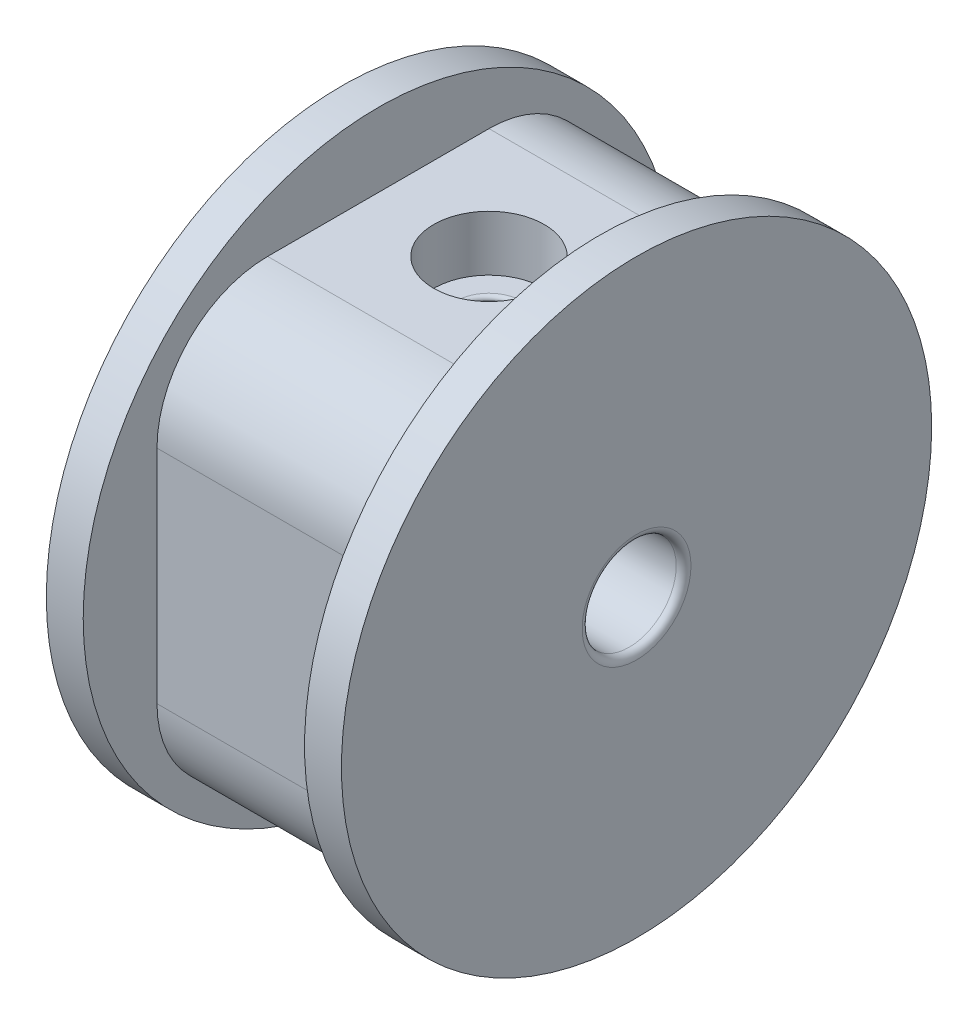
ISO-10303-21;
HEADER;
FILE_DESCRIPTION(('STEP AP214'),'2;1');
FILE_NAME('part.step','',(''),(''),'','','');
FILE_SCHEMA(('AUTOMOTIVE_DESIGN { 1 0 10303 214 1 1 1 1 }'));
ENDSEC;
DATA;
#1=APPLICATION_CONTEXT('core data for automotive mechanical design processes');
#2=APPLICATION_PROTOCOL_DEFINITION('international standard','automotive_design',2000,#1);
#3=PRODUCT_CONTEXT('',#1,'mechanical');
#4=PRODUCT('Part','Part','',(#3));
#5=PRODUCT_RELATED_PRODUCT_CATEGORY('part','',(#4));
#6=PRODUCT_DEFINITION_FORMATION('','',#4);
#7=PRODUCT_DEFINITION_CONTEXT('part definition',#1,'design');
#8=PRODUCT_DEFINITION('design','',#6,#7);
#9=PRODUCT_DEFINITION_SHAPE('','',#8);
#10=(LENGTH_UNIT() NAMED_UNIT(*) SI_UNIT(.MILLI.,.METRE.));
#11=(NAMED_UNIT(*) PLANE_ANGLE_UNIT() SI_UNIT($,.RADIAN.));
#12=(NAMED_UNIT(*) SI_UNIT($,.STERADIAN.) SOLID_ANGLE_UNIT());
#13=UNCERTAINTY_MEASURE_WITH_UNIT(LENGTH_MEASURE(1.E-05),#10,'distance_accuracy_value','');
#14=(GEOMETRIC_REPRESENTATION_CONTEXT(3) GLOBAL_UNCERTAINTY_ASSIGNED_CONTEXT((#13)) GLOBAL_UNIT_ASSIGNED_CONTEXT((#10,
#11,#12)) REPRESENTATION_CONTEXT('',''));
#15=CARTESIAN_POINT('',(0.,0.,0.));
#16=DIRECTION('',(0.,0.,1.));
#17=DIRECTION('',(1.,0.,0.));
#18=AXIS2_PLACEMENT_3D('',#15,#16,#17);
#19=CARTESIAN_POINT('',(12.,0.,0.));
#20=DIRECTION('',(0.,0.,1.));
#21=DIRECTION('',(1.,0.,0.));
#22=AXIS2_PLACEMENT_3D('',#19,#20,#21);
#23=PLANE('',#22);
#24=DIRECTION('',(0.,1.,0.));
#25=VECTOR('',#24,1.);
#26=CARTESIAN_POINT('',(12.,0.,0.));
#27=LINE('',#26,#25);
#28=CARTESIAN_POINT('',(12.,6.,0.));
#29=VERTEX_POINT('',#28);
#30=CARTESIAN_POINT('',(12.,18.,0.));
#31=VERTEX_POINT('',#30);
#32=EDGE_CURVE('E244',#29,#31,#27,.T.);
#33=ORIENTED_EDGE('',*,*,#32,.F.);
#34=DIRECTION('',(-1.,0.,0.));
#35=VECTOR('',#34,1.);
#36=CARTESIAN_POINT('',(12.,6.,0.));
#37=LINE('',#36,#35);
#38=CARTESIAN_POINT('',(0.,6.,0.));
#39=VERTEX_POINT('',#38);
#40=EDGE_CURVE('E109',#29,#39,#37,.T.);
#41=ORIENTED_EDGE('',*,*,#40,.T.);
#42=DIRECTION('',(0.,1.,0.));
#43=VECTOR('',#42,1.);
#44=CARTESIAN_POINT('',(0.,0.,0.));
#45=LINE('',#44,#43);
#46=CARTESIAN_POINT('',(0.,18.,0.));
#47=VERTEX_POINT('',#46);
#48=EDGE_CURVE('E114',#39,#47,#45,.T.);
#49=ORIENTED_EDGE('',*,*,#48,.T.);
#50=DIRECTION('',(-1.,0.,0.));
#51=VECTOR('',#50,1.);
#52=CARTESIAN_POINT('',(12.,18.,0.));
#53=LINE('',#52,#51);
#54=EDGE_CURVE('E98',#47,#31,#53,.F.);
#55=ORIENTED_EDGE('',*,*,#54,.T.);
#56=EDGE_LOOP('',(#33,#41,#49,#55));
#57=FACE_BOUND('',#56,.T.);
#58=ADVANCED_FACE('F34',(#57),#23,.F.);
#59=CARTESIAN_POINT('',(12.,24.,0.));
#60=DIRECTION('',(0.,-1.,0.));
#61=DIRECTION('',(0.,0.,-1.));
#62=AXIS2_PLACEMENT_3D('',#59,#60,#61);
#63=PLANE('',#62);
#64=CARTESIAN_POINT('',(6.,24.,12.));
#65=DIRECTION('',(0.,1.,0.));
#66=DIRECTION('',(0.,0.,1.));
#67=AXIS2_PLACEMENT_3D('',#64,#65,#66);
#68=CIRCLE('',#67,3.);
#69=CARTESIAN_POINT('',(6.,24.,15.));
#70=VERTEX_POINT('',#69);
#71=EDGE_CURVE('E233',#70,#70,#68,.T.);
#72=ORIENTED_EDGE('',*,*,#71,.F.);
#73=EDGE_LOOP('',(#72));
#74=FACE_BOUND('',#73,.T.);
#75=DIRECTION('',(0.,0.,1.));
#76=VECTOR('',#75,1.);
#77=CARTESIAN_POINT('',(12.,24.,0.));
#78=LINE('',#77,#76);
#79=CARTESIAN_POINT('',(12.,24.,6.));
#80=VERTEX_POINT('',#79);
#81=CARTESIAN_POINT('',(12.,24.,18.));
#82=VERTEX_POINT('',#81);
#83=EDGE_CURVE('E246',#80,#82,#78,.T.);
#84=ORIENTED_EDGE('',*,*,#83,.F.);
#85=DIRECTION('',(-1.,0.,0.));
#86=VECTOR('',#85,1.);
#87=CARTESIAN_POINT('',(12.,24.,6.));
#88=LINE('',#87,#86);
#89=CARTESIAN_POINT('',(0.,24.,6.));
#90=VERTEX_POINT('',#89);
#91=EDGE_CURVE('E154',#80,#90,#88,.T.);
#92=ORIENTED_EDGE('',*,*,#91,.T.);
#93=DIRECTION('',(0.,0.,1.));
#94=VECTOR('',#93,1.);
#95=CARTESIAN_POINT('',(0.,24.,0.));
#96=LINE('',#95,#94);
#97=CARTESIAN_POINT('',(0.,24.,18.));
#98=VERTEX_POINT('',#97);
#99=EDGE_CURVE('E118',#90,#98,#96,.T.);
#100=ORIENTED_EDGE('',*,*,#99,.T.);
#101=DIRECTION('',(-1.,0.,0.));
#102=VECTOR('',#101,1.);
#103=CARTESIAN_POINT('',(12.,24.,18.));
#104=LINE('',#103,#102);
#105=EDGE_CURVE('E152',#98,#82,#104,.F.);
#106=ORIENTED_EDGE('',*,*,#105,.T.);
#107=EDGE_LOOP('',(#84,#92,#100,#106));
#108=FACE_BOUND('',#107,.T.);
#109=ADVANCED_FACE('F191',(#74,#108),#63,.F.);
#110=CARTESIAN_POINT('',(12.,0.,24.));
#111=DIRECTION('',(0.,0.,-1.));
#112=DIRECTION('',(-1.,0.,0.));
#113=AXIS2_PLACEMENT_3D('',#110,#111,#112);
#114=PLANE('',#113);
#115=DIRECTION('',(0.,-1.,0.));
#116=VECTOR('',#115,1.);
#117=CARTESIAN_POINT('',(0.,0.,24.));
#118=LINE('',#117,#116);
#119=CARTESIAN_POINT('',(0.,18.,24.));
#120=VERTEX_POINT('',#119);
#121=CARTESIAN_POINT('',(0.,6.,24.));
#122=VERTEX_POINT('',#121);
#123=EDGE_CURVE('E254',#120,#122,#118,.T.);
#124=ORIENTED_EDGE('',*,*,#123,.T.);
#125=DIRECTION('',(-1.,0.,0.));
#126=VECTOR('',#125,1.);
#127=CARTESIAN_POINT('',(12.,6.,24.));
#128=LINE('',#127,#126);
#129=CARTESIAN_POINT('',(12.,6.,24.));
#130=VERTEX_POINT('',#129);
#131=EDGE_CURVE('E49',#122,#130,#128,.F.);
#132=ORIENTED_EDGE('',*,*,#131,.T.);
#133=DIRECTION('',(0.,-1.,0.));
#134=VECTOR('',#133,1.);
#135=CARTESIAN_POINT('',(12.,0.,24.));
#136=LINE('',#135,#134);
#137=CARTESIAN_POINT('',(12.,18.,24.));
#138=VERTEX_POINT('',#137);
#139=EDGE_CURVE('E54',#138,#130,#136,.T.);
#140=ORIENTED_EDGE('',*,*,#139,.F.);
#141=DIRECTION('',(-1.,0.,0.));
#142=VECTOR('',#141,1.);
#143=CARTESIAN_POINT('',(12.,18.,24.));
#144=LINE('',#143,#142);
#145=EDGE_CURVE('E149',#138,#120,#144,.T.);
#146=ORIENTED_EDGE('',*,*,#145,.T.);
#147=EDGE_LOOP('',(#124,#132,#140,#146));
#148=FACE_BOUND('',#147,.T.);
#149=ADVANCED_FACE('F196',(#148),#114,.F.);
#150=CARTESIAN_POINT('',(12.,0.,0.));
#151=DIRECTION('',(0.,1.,0.));
#152=DIRECTION('',(0.,0.,1.));
#153=AXIS2_PLACEMENT_3D('',#150,#151,#152);
#154=PLANE('',#153);
#155=DIRECTION('',(0.,0.,-1.));
#156=VECTOR('',#155,1.);
#157=CARTESIAN_POINT('',(0.,0.,0.));
#158=LINE('',#157,#156);
#159=CARTESIAN_POINT('',(0.,0.,18.));
#160=VERTEX_POINT('',#159);
#161=CARTESIAN_POINT('',(0.,0.,6.));
#162=VERTEX_POINT('',#161);
#163=EDGE_CURVE('E247',#160,#162,#158,.T.);
#164=ORIENTED_EDGE('',*,*,#163,.T.);
#165=DIRECTION('',(-1.,0.,0.));
#166=VECTOR('',#165,1.);
#167=CARTESIAN_POINT('',(12.,0.,6.));
#168=LINE('',#167,#166);
#169=CARTESIAN_POINT('',(12.,0.,6.));
#170=VERTEX_POINT('',#169);
#171=EDGE_CURVE('E137',#162,#170,#168,.F.);
#172=ORIENTED_EDGE('',*,*,#171,.T.);
#173=DIRECTION('',(0.,0.,-1.));
#174=VECTOR('',#173,1.);
#175=CARTESIAN_POINT('',(12.,0.,0.));
#176=LINE('',#175,#174);
#177=CARTESIAN_POINT('',(12.,0.,18.));
#178=VERTEX_POINT('',#177);
#179=EDGE_CURVE('E110',#178,#170,#176,.T.);
#180=ORIENTED_EDGE('',*,*,#179,.F.);
#181=DIRECTION('',(-1.,0.,0.));
#182=VECTOR('',#181,1.);
#183=CARTESIAN_POINT('',(12.,0.,18.));
#184=LINE('',#183,#182);
#185=EDGE_CURVE('E134',#178,#160,#184,.T.);
#186=ORIENTED_EDGE('',*,*,#185,.T.);
#187=EDGE_LOOP('',(#164,#172,#180,#186));
#188=FACE_BOUND('',#187,.T.);
#189=ADVANCED_FACE('F205',(#188),#154,.F.);
#190=CARTESIAN_POINT('',(12.,6.,6.));
#191=DIRECTION('',(-1.,0.,0.));
#192=DIRECTION('',(0.,0.,1.));
#193=AXIS2_PLACEMENT_3D('',#190,#191,#192);
#194=CYLINDRICAL_SURFACE('',#193,6.);
#195=CARTESIAN_POINT('',(12.,6.,6.));
#196=DIRECTION('',(1.,0.,0.));
#197=DIRECTION('',(0.,0.,-1.));
#198=AXIS2_PLACEMENT_3D('',#195,#196,#197);
#199=CIRCLE('',#198,6.);
#200=EDGE_CURVE('E146',#170,#29,#199,.T.);
#201=ORIENTED_EDGE('',*,*,#200,.F.);
#202=ORIENTED_EDGE('',*,*,#171,.F.);
#203=CARTESIAN_POINT('',(0.,6.,6.));
#204=DIRECTION('',(1.,0.,0.));
#205=DIRECTION('',(0.,0.,-1.));
#206=AXIS2_PLACEMENT_3D('',#203,#204,#205);
#207=CIRCLE('',#206,6.);
#208=EDGE_CURVE('E128',#39,#162,#207,.F.);
#209=ORIENTED_EDGE('',*,*,#208,.F.);
#210=ORIENTED_EDGE('',*,*,#40,.F.);
#211=EDGE_LOOP('',(#201,#202,#209,#210));
#212=FACE_BOUND('',#211,.T.);
#213=ADVANCED_FACE('F201',(#212),#194,.T.);
#214=CARTESIAN_POINT('',(12.,6.,18.));
#215=DIRECTION('',(-1.,0.,0.));
#216=DIRECTION('',(0.,0.,1.));
#217=AXIS2_PLACEMENT_3D('',#214,#215,#216);
#218=CYLINDRICAL_SURFACE('',#217,6.);
#219=CARTESIAN_POINT('',(12.,6.,18.));
#220=DIRECTION('',(1.,0.,0.));
#221=DIRECTION('',(0.,0.,-1.));
#222=AXIS2_PLACEMENT_3D('',#219,#220,#221);
#223=CIRCLE('',#222,6.);
#224=EDGE_CURVE('E143',#130,#178,#223,.T.);
#225=ORIENTED_EDGE('',*,*,#224,.F.);
#226=ORIENTED_EDGE('',*,*,#131,.F.);
#227=CARTESIAN_POINT('',(0.,6.,18.));
#228=DIRECTION('',(1.,0.,0.));
#229=DIRECTION('',(0.,0.,-1.));
#230=AXIS2_PLACEMENT_3D('',#227,#228,#229);
#231=CIRCLE('',#230,6.);
#232=EDGE_CURVE('E124',#160,#122,#231,.F.);
#233=ORIENTED_EDGE('',*,*,#232,.F.);
#234=ORIENTED_EDGE('',*,*,#185,.F.);
#235=EDGE_LOOP('',(#225,#226,#233,#234));
#236=FACE_BOUND('',#235,.T.);
#237=ADVANCED_FACE('F204',(#236),#218,.T.);
#238=CARTESIAN_POINT('',(12.,18.,6.));
#239=DIRECTION('',(-1.,0.,0.));
#240=DIRECTION('',(0.,0.,1.));
#241=AXIS2_PLACEMENT_3D('',#238,#239,#240);
#242=CYLINDRICAL_SURFACE('',#241,6.);
#243=CARTESIAN_POINT('',(12.,18.,6.));
#244=DIRECTION('',(1.,0.,0.));
#245=DIRECTION('',(0.,0.,-1.));
#246=AXIS2_PLACEMENT_3D('',#243,#244,#245);
#247=CIRCLE('',#246,6.);
#248=EDGE_CURVE('E106',#31,#80,#247,.T.);
#249=ORIENTED_EDGE('',*,*,#248,.F.);
#250=ORIENTED_EDGE('',*,*,#54,.F.);
#251=CARTESIAN_POINT('',(0.,18.,6.));
#252=DIRECTION('',(1.,0.,0.));
#253=DIRECTION('',(0.,0.,-1.));
#254=AXIS2_PLACEMENT_3D('',#251,#252,#253);
#255=CIRCLE('',#254,6.);
#256=EDGE_CURVE('E103',#90,#47,#255,.F.);
#257=ORIENTED_EDGE('',*,*,#256,.F.);
#258=ORIENTED_EDGE('',*,*,#91,.F.);
#259=EDGE_LOOP('',(#249,#250,#257,#258));
#260=FACE_BOUND('',#259,.T.);
#261=ADVANCED_FACE('F100',(#260),#242,.T.);
#262=CARTESIAN_POINT('',(12.,18.,18.));
#263=DIRECTION('',(-1.,0.,0.));
#264=DIRECTION('',(0.,0.,1.));
#265=AXIS2_PLACEMENT_3D('',#262,#263,#264);
#266=CYLINDRICAL_SURFACE('',#265,6.);
#267=CARTESIAN_POINT('',(12.,18.,18.));
#268=DIRECTION('',(1.,0.,0.));
#269=DIRECTION('',(0.,0.,-1.));
#270=AXIS2_PLACEMENT_3D('',#267,#268,#269);
#271=CIRCLE('',#270,6.);
#272=EDGE_CURVE('E139',#82,#138,#271,.T.);
#273=ORIENTED_EDGE('',*,*,#272,.F.);
#274=ORIENTED_EDGE('',*,*,#105,.F.);
#275=CARTESIAN_POINT('',(0.,18.,18.));
#276=DIRECTION('',(1.,0.,0.));
#277=DIRECTION('',(0.,0.,-1.));
#278=AXIS2_PLACEMENT_3D('',#275,#276,#277);
#279=CIRCLE('',#278,6.);
#280=EDGE_CURVE('E125',#120,#98,#279,.F.);
#281=ORIENTED_EDGE('',*,*,#280,.F.);
#282=ORIENTED_EDGE('',*,*,#145,.F.);
#283=EDGE_LOOP('',(#273,#274,#281,#282));
#284=FACE_BOUND('',#283,.T.);
#285=ADVANCED_FACE('F212',(#284),#266,.T.);
#286=CARTESIAN_POINT('',(6.,21.,12.));
#287=DIRECTION('',(0.,1.,0.));
#288=DIRECTION('',(0.,0.,1.));
#289=AXIS2_PLACEMENT_3D('',#286,#287,#288);
#290=PLANE('',#289);
#291=CARTESIAN_POINT('',(6.,21.,12.));
#292=DIRECTION('',(0.,1.,0.));
#293=DIRECTION('',(0.,0.,1.));
#294=AXIS2_PLACEMENT_3D('',#291,#292,#293);
#295=CIRCLE('',#294,1.8);
#296=CARTESIAN_POINT('',(6.,21.,13.8));
#297=VERTEX_POINT('',#296);
#298=EDGE_CURVE('E156',#297,#297,#295,.F.);
#299=ORIENTED_EDGE('',*,*,#298,.T.);
#300=EDGE_LOOP('',(#299));
#301=FACE_BOUND('',#300,.T.);
#302=CARTESIAN_POINT('',(6.,21.,12.));
#303=DIRECTION('',(0.,1.,0.));
#304=DIRECTION('',(0.,0.,1.));
#305=AXIS2_PLACEMENT_3D('',#302,#303,#304);
#306=CIRCLE('',#305,3.);
#307=CARTESIAN_POINT('',(6.,21.,15.));
#308=VERTEX_POINT('',#307);
#309=EDGE_CURVE('E231',#308,#308,#306,.T.);
#310=ORIENTED_EDGE('',*,*,#309,.T.);
#311=EDGE_LOOP('',(#310));
#312=FACE_BOUND('',#311,.T.);
#313=ADVANCED_FACE('F215',(#301,#312),#290,.T.);
#314=CARTESIAN_POINT('',(6.,21.,12.));
#315=DIRECTION('',(0.,1.,0.));
#316=DIRECTION('',(0.,0.,1.));
#317=AXIS2_PLACEMENT_3D('',#314,#315,#316);
#318=CYLINDRICAL_SURFACE('',#317,3.);
#319=ORIENTED_EDGE('',*,*,#309,.F.);
#320=EDGE_LOOP('',(#319));
#321=FACE_BOUND('',#320,.T.);
#322=ORIENTED_EDGE('',*,*,#71,.T.);
#323=EDGE_LOOP('',(#322));
#324=FACE_BOUND('',#323,.T.);
#325=ADVANCED_FACE('F227',(#321,#324),#318,.F.);
#326=CARTESIAN_POINT('',(6.,15.,12.));
#327=DIRECTION('',(0.,1.,0.));
#328=DIRECTION('',(0.,0.,1.));
#329=AXIS2_PLACEMENT_3D('',#326,#327,#328);
#330=PLANE('',#329);
#331=CARTESIAN_POINT('',(6.,15.,12.));
#332=DIRECTION('',(0.,1.,0.));
#333=DIRECTION('',(0.,0.,1.));
#334=AXIS2_PLACEMENT_3D('',#331,#332,#333);
#335=CIRCLE('',#334,1.6);
#336=CARTESIAN_POINT('',(6.,15.,13.6));
#337=VERTEX_POINT('',#336);
#338=EDGE_CURVE('E119',#337,#337,#335,.T.);
#339=ORIENTED_EDGE('',*,*,#338,.T.);
#340=EDGE_LOOP('',(#339));
#341=FACE_BOUND('',#340,.T.);
#342=ADVANCED_FACE('F277',(#341),#330,.T.);
#343=CARTESIAN_POINT('',(6.,15.,12.));
#344=DIRECTION('',(0.,1.,0.));
#345=DIRECTION('',(0.,0.,1.));
#346=AXIS2_PLACEMENT_3D('',#343,#344,#345);
#347=CYLINDRICAL_SURFACE('',#346,1.6);
#348=CARTESIAN_POINT('',(6.,20.8,12.));
#349=DIRECTION('',(0.,1.,0.));
#350=DIRECTION('',(0.,0.,1.));
#351=AXIS2_PLACEMENT_3D('',#348,#349,#350);
#352=CIRCLE('',#351,1.6);
#353=CARTESIAN_POINT('',(6.,20.8,13.6));
#354=VERTEX_POINT('',#353);
#355=EDGE_CURVE('E159',#354,#354,#352,.T.);
#356=ORIENTED_EDGE('',*,*,#355,.T.);
#357=EDGE_LOOP('',(#356));
#358=FACE_BOUND('',#357,.T.);
#359=ORIENTED_EDGE('',*,*,#338,.F.);
#360=EDGE_LOOP('',(#359));
#361=FACE_BOUND('',#360,.T.);
#362=ADVANCED_FACE('F274',(#358,#361),#347,.F.);
#363=CARTESIAN_POINT('',(12.,12.,12.));
#364=DIRECTION('',(1.,0.,0.));
#365=DIRECTION('',(0.,0.,-1.));
#366=AXIS2_PLACEMENT_3D('',#363,#364,#365);
#367=PLANE('',#366);
#368=ORIENTED_EDGE('',*,*,#224,.T.);
#369=ORIENTED_EDGE('',*,*,#179,.T.);
#370=ORIENTED_EDGE('',*,*,#200,.T.);
#371=ORIENTED_EDGE('',*,*,#32,.T.);
#372=ORIENTED_EDGE('',*,*,#248,.T.);
#373=ORIENTED_EDGE('',*,*,#83,.T.);
#374=ORIENTED_EDGE('',*,*,#272,.T.);
#375=ORIENTED_EDGE('',*,*,#139,.T.);
#376=EDGE_LOOP('',(#368,#369,#370,#371,#372,#373,#374,#375));
#377=FACE_BOUND('',#376,.T.);
#378=CARTESIAN_POINT('',(12.,12.,12.));
#379=DIRECTION('',(1.,0.,0.));
#380=DIRECTION('',(0.,0.,-1.));
#381=AXIS2_PLACEMENT_3D('',#378,#379,#380);
#382=CIRCLE('',#381,16.);
#383=CARTESIAN_POINT('',(12.,12.,-4.));
#384=VERTEX_POINT('',#383);
#385=EDGE_CURVE('E241',#384,#384,#382,.T.);
#386=ORIENTED_EDGE('',*,*,#385,.F.);
#387=EDGE_LOOP('',(#386));
#388=FACE_BOUND('',#387,.T.);
#389=ADVANCED_FACE('F262',(#377,#388),#367,.F.);
#390=CARTESIAN_POINT('',(14.,12.,12.));
#391=DIRECTION('',(1.,0.,0.));
#392=DIRECTION('',(0.,0.,-1.));
#393=AXIS2_PLACEMENT_3D('',#390,#391,#392);
#394=PLANE('',#393);
#395=CARTESIAN_POINT('',(14.,12.,12.));
#396=DIRECTION('',(1.,0.,0.));
#397=DIRECTION('',(0.,0.,-1.));
#398=AXIS2_PLACEMENT_3D('',#395,#396,#397);
#399=CIRCLE('',#398,2.95);
#400=CARTESIAN_POINT('',(14.,12.,9.05));
#401=VERTEX_POINT('',#400);
#402=EDGE_CURVE('E11',#401,#401,#399,.F.);
#403=ORIENTED_EDGE('',*,*,#402,.T.);
#404=EDGE_LOOP('',(#403));
#405=FACE_BOUND('',#404,.T.);
#406=CARTESIAN_POINT('',(14.,12.,12.));
#407=DIRECTION('',(1.,0.,0.));
#408=DIRECTION('',(0.,0.,-1.));
#409=AXIS2_PLACEMENT_3D('',#406,#407,#408);
#410=CIRCLE('',#409,16.);
#411=CARTESIAN_POINT('',(14.,12.,-4.));
#412=VERTEX_POINT('',#411);
#413=EDGE_CURVE('E238',#412,#412,#410,.T.);
#414=ORIENTED_EDGE('',*,*,#413,.T.);
#415=EDGE_LOOP('',(#414));
#416=FACE_BOUND('',#415,.T.);
#417=ADVANCED_FACE('F287',(#405,#416),#394,.T.);
#418=CARTESIAN_POINT('',(14.,12.,12.));
#419=DIRECTION('',(-1.,0.,0.));
#420=DIRECTION('',(0.,0.,1.));
#421=AXIS2_PLACEMENT_3D('',#418,#419,#420);
#422=CYLINDRICAL_SURFACE('',#421,16.);
#423=ORIENTED_EDGE('',*,*,#413,.F.);
#424=EDGE_LOOP('',(#423));
#425=FACE_BOUND('',#424,.T.);
#426=ORIENTED_EDGE('',*,*,#385,.T.);
#427=EDGE_LOOP('',(#426));
#428=FACE_BOUND('',#427,.T.);
#429=ADVANCED_FACE('F284',(#425,#428),#422,.T.);
#430=CARTESIAN_POINT('',(-2.,12.,12.));
#431=DIRECTION('',(-1.,0.,0.));
#432=DIRECTION('',(0.,0.,1.));
#433=AXIS2_PLACEMENT_3D('',#430,#431,#432);
#434=PLANE('',#433);
#435=CARTESIAN_POINT('',(-2.,12.,12.));
#436=DIRECTION('',(-1.,0.,0.));
#437=DIRECTION('',(0.,0.,1.));
#438=AXIS2_PLACEMENT_3D('',#435,#436,#437);
#439=CIRCLE('',#438,2.95);
#440=CARTESIAN_POINT('',(-2.,12.,14.95));
#441=VERTEX_POINT('',#440);
#442=EDGE_CURVE('E42',#441,#441,#439,.F.);
#443=ORIENTED_EDGE('',*,*,#442,.T.);
#444=EDGE_LOOP('',(#443));
#445=FACE_BOUND('',#444,.T.);
#446=CARTESIAN_POINT('',(-2.,12.,12.));
#447=DIRECTION('',(-1.,0.,0.));
#448=DIRECTION('',(0.,0.,1.));
#449=AXIS2_PLACEMENT_3D('',#446,#447,#448);
#450=CIRCLE('',#449,16.);
#451=CARTESIAN_POINT('',(-2.,12.,28.));
#452=VERTEX_POINT('',#451);
#453=EDGE_CURVE('E430',#452,#452,#450,.T.);
#454=ORIENTED_EDGE('',*,*,#453,.T.);
#455=EDGE_LOOP('',(#454));
#456=FACE_BOUND('',#455,.T.);
#457=ADVANCED_FACE('F170',(#445,#456),#434,.T.);
#458=CARTESIAN_POINT('',(-2.,12.,12.));
#459=DIRECTION('',(1.,0.,0.));
#460=DIRECTION('',(0.,0.,-1.));
#461=AXIS2_PLACEMENT_3D('',#458,#459,#460);
#462=CYLINDRICAL_SURFACE('',#461,16.);
#463=ORIENTED_EDGE('',*,*,#453,.F.);
#464=EDGE_LOOP('',(#463));
#465=FACE_BOUND('',#464,.T.);
#466=CARTESIAN_POINT('',(0.,12.,12.));
#467=DIRECTION('',(-1.,0.,0.));
#468=DIRECTION('',(0.,0.,1.));
#469=AXIS2_PLACEMENT_3D('',#466,#467,#468);
#470=CIRCLE('',#469,16.);
#471=CARTESIAN_POINT('',(0.,12.,28.));
#472=VERTEX_POINT('',#471);
#473=EDGE_CURVE('E428',#472,#472,#470,.T.);
#474=ORIENTED_EDGE('',*,*,#473,.T.);
#475=EDGE_LOOP('',(#474));
#476=FACE_BOUND('',#475,.T.);
#477=ADVANCED_FACE('F294',(#465,#476),#462,.T.);
#478=CARTESIAN_POINT('',(0.,12.,12.));
#479=DIRECTION('',(-1.,0.,0.));
#480=DIRECTION('',(0.,0.,1.));
#481=AXIS2_PLACEMENT_3D('',#478,#479,#480);
#482=PLANE('',#481);
#483=ORIENTED_EDGE('',*,*,#473,.F.);
#484=EDGE_LOOP('',(#483));
#485=FACE_BOUND('',#484,.T.);
#486=ORIENTED_EDGE('',*,*,#48,.F.);
#487=ORIENTED_EDGE('',*,*,#208,.T.);
#488=ORIENTED_EDGE('',*,*,#163,.F.);
#489=ORIENTED_EDGE('',*,*,#232,.T.);
#490=ORIENTED_EDGE('',*,*,#123,.F.);
#491=ORIENTED_EDGE('',*,*,#280,.T.);
#492=ORIENTED_EDGE('',*,*,#99,.F.);
#493=ORIENTED_EDGE('',*,*,#256,.T.);
#494=EDGE_LOOP('',(#486,#487,#488,#489,#490,#491,#492,#493));
#495=FACE_BOUND('',#494,.T.);
#496=ADVANCED_FACE('F122',(#485,#495),#482,.F.);
#497=CARTESIAN_POINT('',(20.,12.,12.));
#498=DIRECTION('',(-1.,0.,0.));
#499=DIRECTION('',(0.,0.,1.));
#500=AXIS2_PLACEMENT_3D('',#497,#498,#499);
#501=CYLINDRICAL_SURFACE('',#500,2.55);
#502=CARTESIAN_POINT('',(-1.6,12.,12.));
#503=DIRECTION('',(-1.,0.,0.));
#504=DIRECTION('',(0.,0.,1.));
#505=AXIS2_PLACEMENT_3D('',#502,#503,#504);
#506=CIRCLE('',#505,2.55);
#507=CARTESIAN_POINT('',(-1.6,12.,14.55));
#508=VERTEX_POINT('',#507);
#509=EDGE_CURVE('E165',#508,#508,#506,.T.);
#510=ORIENTED_EDGE('',*,*,#509,.T.);
#511=EDGE_LOOP('',(#510));
#512=FACE_BOUND('',#511,.T.);
#513=CARTESIAN_POINT('',(13.6,12.,12.));
#514=DIRECTION('',(1.,0.,0.));
#515=DIRECTION('',(0.,0.,-1.));
#516=AXIS2_PLACEMENT_3D('',#513,#514,#515);
#517=CIRCLE('',#516,2.55);
#518=CARTESIAN_POINT('',(13.6,12.,9.45));
#519=VERTEX_POINT('',#518);
#520=EDGE_CURVE('E162',#519,#519,#517,.T.);
#521=ORIENTED_EDGE('',*,*,#520,.T.);
#522=EDGE_LOOP('',(#521));
#523=FACE_BOUND('',#522,.T.);
#524=ADVANCED_FACE('F179',(#512,#523),#501,.F.);
#525=CARTESIAN_POINT('',(6.,20.8,12.));
#526=DIRECTION('',(0.,1.,0.));
#527=DIRECTION('',(0.,0.,1.));
#528=AXIS2_PLACEMENT_3D('',#525,#526,#527);
#529=TOROIDAL_SURFACE('',#528,1.8,0.2);
#530=ORIENTED_EDGE('',*,*,#355,.F.);
#531=EDGE_LOOP('',(#530));
#532=FACE_BOUND('',#531,.T.);
#533=ORIENTED_EDGE('',*,*,#298,.F.);
#534=EDGE_LOOP('',(#533));
#535=FACE_BOUND('',#534,.T.);
#536=ADVANCED_FACE('F176',(#532,#535),#529,.T.);
#537=CARTESIAN_POINT('',(-1.6,12.,12.));
#538=DIRECTION('',(-1.,0.,0.));
#539=DIRECTION('',(0.,0.,1.));
#540=AXIS2_PLACEMENT_3D('',#537,#538,#539);
#541=TOROIDAL_SURFACE('',#540,2.95,0.4);
#542=ORIENTED_EDGE('',*,*,#442,.F.);
#543=EDGE_LOOP('',(#542));
#544=FACE_BOUND('',#543,.T.);
#545=ORIENTED_EDGE('',*,*,#509,.F.);
#546=EDGE_LOOP('',(#545));
#547=FACE_BOUND('',#546,.T.);
#548=ADVANCED_FACE('F173',(#544,#547),#541,.T.);
#549=CARTESIAN_POINT('',(13.6,12.,12.));
#550=DIRECTION('',(1.,0.,0.));
#551=DIRECTION('',(0.,0.,-1.));
#552=AXIS2_PLACEMENT_3D('',#549,#550,#551);
#553=TOROIDAL_SURFACE('',#552,2.95,0.4);
#554=ORIENTED_EDGE('',*,*,#402,.F.);
#555=EDGE_LOOP('',(#554));
#556=FACE_BOUND('',#555,.T.);
#557=ORIENTED_EDGE('',*,*,#520,.F.);
#558=EDGE_LOOP('',(#557));
#559=FACE_BOUND('',#558,.T.);
#560=ADVANCED_FACE('F36',(#556,#559),#553,.T.);
#561=CLOSED_SHELL('',(#58,#109,#149,#189,#213,#237,#261,#285,#313,#325,#342,#362,#389,#417,#429,
#457,#477,#496,#524,#536,#548,#560));
#562=MANIFOLD_SOLID_BREP('B2',#561);
#563=ADVANCED_BREP_SHAPE_REPRESENTATION('',(#18,#562),#14);
#564=SHAPE_DEFINITION_REPRESENTATION(#9,#563);
ENDSEC;
END-ISO-10303-21;
